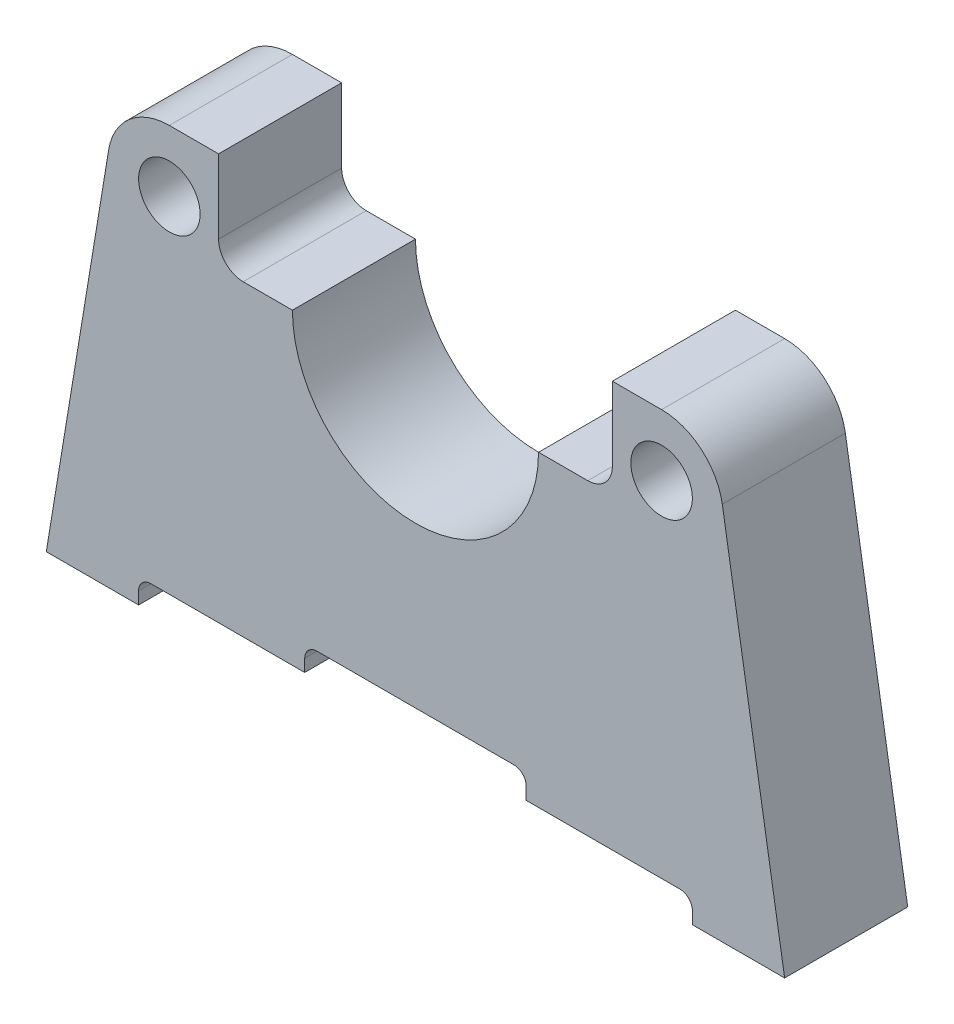
ISO-10303-21;
HEADER;
FILE_DESCRIPTION(('STEP AP214'),'2;1');
FILE_NAME('part.step','',(''),(''),'','','');
FILE_SCHEMA(('AUTOMOTIVE_DESIGN { 1 0 10303 214 1 1 1 1 }'));
ENDSEC;
DATA;
#1=APPLICATION_CONTEXT('core data for automotive mechanical design processes');
#2=APPLICATION_PROTOCOL_DEFINITION('international standard','automotive_design',2000,#1);
#3=PRODUCT_CONTEXT('',#1,'mechanical');
#4=PRODUCT('Part','Part','',(#3));
#5=PRODUCT_RELATED_PRODUCT_CATEGORY('part','',(#4));
#6=PRODUCT_DEFINITION_FORMATION('','',#4);
#7=PRODUCT_DEFINITION_CONTEXT('part definition',#1,'design');
#8=PRODUCT_DEFINITION('design','',#6,#7);
#9=PRODUCT_DEFINITION_SHAPE('','',#8);
#10=(LENGTH_UNIT() NAMED_UNIT(*) SI_UNIT(.MILLI.,.METRE.));
#11=(NAMED_UNIT(*) PLANE_ANGLE_UNIT() SI_UNIT($,.RADIAN.));
#12=(NAMED_UNIT(*) SI_UNIT($,.STERADIAN.) SOLID_ANGLE_UNIT());
#13=UNCERTAINTY_MEASURE_WITH_UNIT(LENGTH_MEASURE(1.E-05),#10,'distance_accuracy_value','');
#14=(GEOMETRIC_REPRESENTATION_CONTEXT(3) GLOBAL_UNCERTAINTY_ASSIGNED_CONTEXT((#13)) GLOBAL_UNIT_ASSIGNED_CONTEXT((#10,
#11,#12)) REPRESENTATION_CONTEXT('',''));
#15=CARTESIAN_POINT('',(0.,0.,0.));
#16=DIRECTION('',(0.,0.,1.));
#17=DIRECTION('',(1.,0.,0.));
#18=AXIS2_PLACEMENT_3D('',#15,#16,#17);
#19=CARTESIAN_POINT('',(-20.,30.,10.));
#20=DIRECTION('',(0.,0.,-1.));
#21=DIRECTION('',(-1.,0.,0.));
#22=AXIS2_PLACEMENT_3D('',#19,#20,#21);
#23=PLANE('',#22);
#24=DIRECTION('',(-0.16224989991992,-0.98674969975976,0.));
#25=VECTOR('',#24,1.);
#26=CARTESIAN_POINT('',(-30.,0.,10.));
#27=LINE('',#26,#25);
#28=CARTESIAN_POINT('',(-24.9337484987988,30.8112494995996,10.));
#29=VERTEX_POINT('',#28);
#30=CARTESIAN_POINT('',(-30.,0.,10.));
#31=VERTEX_POINT('',#30);
#32=EDGE_CURVE('E293',#29,#31,#27,.T.);
#33=ORIENTED_EDGE('',*,*,#32,.T.);
#34=DIRECTION('',(1.,0.,0.));
#35=VECTOR('',#34,1.);
#36=CARTESIAN_POINT('',(-30.,0.,10.));
#37=LINE('',#36,#35);
#38=CARTESIAN_POINT('',(-22.5,0.,10.));
#39=VERTEX_POINT('',#38);
#40=EDGE_CURVE('E151',#31,#39,#37,.T.);
#41=ORIENTED_EDGE('',*,*,#40,.T.);
#42=DIRECTION('',(0.,1.,0.));
#43=VECTOR('',#42,1.);
#44=CARTESIAN_POINT('',(-22.5,0.,10.));
#45=LINE('',#44,#43);
#46=CARTESIAN_POINT('',(-22.5,1.,10.));
#47=VERTEX_POINT('',#46);
#48=EDGE_CURVE('E362',#39,#47,#45,.T.);
#49=ORIENTED_EDGE('',*,*,#48,.T.);
#50=CARTESIAN_POINT('',(-21.5,1.,10.));
#51=DIRECTION('',(0.,0.,-1.));
#52=DIRECTION('',(-1.,0.,0.));
#53=AXIS2_PLACEMENT_3D('',#50,#51,#52);
#54=CIRCLE('',#53,1.);
#55=CARTESIAN_POINT('',(-21.5,2.,10.));
#56=VERTEX_POINT('',#55);
#57=EDGE_CURVE('E381',#47,#56,#54,.T.);
#58=ORIENTED_EDGE('',*,*,#57,.T.);
#59=DIRECTION('',(1.,0.,0.));
#60=VECTOR('',#59,1.);
#61=CARTESIAN_POINT('',(-21.5,2.,10.));
#62=LINE('',#61,#60);
#63=CARTESIAN_POINT('',(-9.,2.,10.));
#64=VERTEX_POINT('',#63);
#65=EDGE_CURVE('E378',#56,#64,#62,.T.);
#66=ORIENTED_EDGE('',*,*,#65,.T.);
#67=DIRECTION('',(0.,1.,0.));
#68=VECTOR('',#67,1.);
#69=CARTESIAN_POINT('',(-9.,2.,10.));
#70=LINE('',#69,#68);
#71=CARTESIAN_POINT('',(-9.,2.99999999999999,10.));
#72=VERTEX_POINT('',#71);
#73=EDGE_CURVE('E380',#64,#72,#70,.T.);
#74=ORIENTED_EDGE('',*,*,#73,.T.);
#75=CARTESIAN_POINT('',(-8.,2.99999999999999,10.));
#76=DIRECTION('',(0.,0.,-1.));
#77=DIRECTION('',(-1.,0.,0.));
#78=AXIS2_PLACEMENT_3D('',#75,#76,#77);
#79=CIRCLE('',#78,1.);
#80=CARTESIAN_POINT('',(-8.,3.99999999999999,10.));
#81=VERTEX_POINT('',#80);
#82=EDGE_CURVE('E383',#72,#81,#79,.T.);
#83=ORIENTED_EDGE('',*,*,#82,.T.);
#84=DIRECTION('',(1.,0.,0.));
#85=VECTOR('',#84,1.);
#86=CARTESIAN_POINT('',(-8.,3.99999999999999,10.));
#87=LINE('',#86,#85);
#88=CARTESIAN_POINT('',(8.,3.99999999999999,10.));
#89=VERTEX_POINT('',#88);
#90=EDGE_CURVE('E389',#81,#89,#87,.T.);
#91=ORIENTED_EDGE('',*,*,#90,.T.);
#92=CARTESIAN_POINT('',(8.,2.99999999999999,10.));
#93=DIRECTION('',(0.,0.,-1.));
#94=DIRECTION('',(1.,0.,0.));
#95=AXIS2_PLACEMENT_3D('',#92,#93,#94);
#96=CIRCLE('',#95,1.);
#97=CARTESIAN_POINT('',(9.,2.99999999999999,10.));
#98=VERTEX_POINT('',#97);
#99=EDGE_CURVE('E391',#89,#98,#96,.T.);
#100=ORIENTED_EDGE('',*,*,#99,.T.);
#101=DIRECTION('',(0.,-1.,0.));
#102=VECTOR('',#101,1.);
#103=CARTESIAN_POINT('',(9.,2.,10.));
#104=LINE('',#103,#102);
#105=CARTESIAN_POINT('',(9.,2.,10.));
#106=VERTEX_POINT('',#105);
#107=EDGE_CURVE('E393',#98,#106,#104,.T.);
#108=ORIENTED_EDGE('',*,*,#107,.T.);
#109=DIRECTION('',(1.,0.,0.));
#110=VECTOR('',#109,1.);
#111=CARTESIAN_POINT('',(21.5,2.,10.));
#112=LINE('',#111,#110);
#113=CARTESIAN_POINT('',(21.5,2.,10.));
#114=VERTEX_POINT('',#113);
#115=EDGE_CURVE('E395',#106,#114,#112,.T.);
#116=ORIENTED_EDGE('',*,*,#115,.T.);
#117=CARTESIAN_POINT('',(21.5,1.,10.));
#118=DIRECTION('',(0.,0.,-1.));
#119=DIRECTION('',(-1.,0.,0.));
#120=AXIS2_PLACEMENT_3D('',#117,#118,#119);
#121=CIRCLE('',#120,1.);
#122=CARTESIAN_POINT('',(22.5,1.,10.));
#123=VERTEX_POINT('',#122);
#124=EDGE_CURVE('E397',#114,#123,#121,.T.);
#125=ORIENTED_EDGE('',*,*,#124,.T.);
#126=DIRECTION('',(0.,-1.,0.));
#127=VECTOR('',#126,1.);
#128=CARTESIAN_POINT('',(22.5,0.,10.));
#129=LINE('',#128,#127);
#130=CARTESIAN_POINT('',(22.5,0.,10.));
#131=VERTEX_POINT('',#130);
#132=EDGE_CURVE('E399',#123,#131,#129,.T.);
#133=ORIENTED_EDGE('',*,*,#132,.T.);
#134=DIRECTION('',(1.,0.,0.));
#135=VECTOR('',#134,1.);
#136=CARTESIAN_POINT('',(30.,0.,10.));
#137=LINE('',#136,#135);
#138=CARTESIAN_POINT('',(30.,0.,10.));
#139=VERTEX_POINT('',#138);
#140=EDGE_CURVE('E401',#131,#139,#137,.T.);
#141=ORIENTED_EDGE('',*,*,#140,.T.);
#142=DIRECTION('',(-0.16224989991992,0.98674969975976,0.));
#143=VECTOR('',#142,1.);
#144=CARTESIAN_POINT('',(30.,0.,10.));
#145=LINE('',#144,#143);
#146=CARTESIAN_POINT('',(24.9337484987988,30.8112494995996,10.));
#147=VERTEX_POINT('',#146);
#148=EDGE_CURVE('E403',#139,#147,#145,.T.);
#149=ORIENTED_EDGE('',*,*,#148,.T.);
#150=CARTESIAN_POINT('',(20.,30.,10.));
#151=DIRECTION('',(0.,0.,1.));
#152=DIRECTION('',(-1.,0.,0.));
#153=AXIS2_PLACEMENT_3D('',#150,#151,#152);
#154=CIRCLE('',#153,5.);
#155=CARTESIAN_POINT('',(20.,35.,10.));
#156=VERTEX_POINT('',#155);
#157=EDGE_CURVE('E405',#147,#156,#154,.T.);
#158=ORIENTED_EDGE('',*,*,#157,.T.);
#159=DIRECTION('',(-1.,0.,0.));
#160=VECTOR('',#159,1.);
#161=CARTESIAN_POINT('',(20.,35.,10.));
#162=LINE('',#161,#160);
#163=CARTESIAN_POINT('',(16.,35.,10.));
#164=VERTEX_POINT('',#163);
#165=EDGE_CURVE('E407',#156,#164,#162,.T.);
#166=ORIENTED_EDGE('',*,*,#165,.T.);
#167=DIRECTION('',(0.,-1.,0.));
#168=VECTOR('',#167,1.);
#169=CARTESIAN_POINT('',(16.,35.,10.));
#170=LINE('',#169,#168);
#171=CARTESIAN_POINT('',(16.,29.,10.));
#172=VERTEX_POINT('',#171);
#173=EDGE_CURVE('E409',#164,#172,#170,.T.);
#174=ORIENTED_EDGE('',*,*,#173,.T.);
#175=CARTESIAN_POINT('',(14.,29.,10.));
#176=DIRECTION('',(0.,0.,-1.));
#177=DIRECTION('',(1.,0.,0.));
#178=AXIS2_PLACEMENT_3D('',#175,#176,#177);
#179=CIRCLE('',#178,2.);
#180=CARTESIAN_POINT('',(14.,27.,10.));
#181=VERTEX_POINT('',#180);
#182=EDGE_CURVE('E411',#172,#181,#179,.T.);
#183=ORIENTED_EDGE('',*,*,#182,.T.);
#184=DIRECTION('',(-1.,0.,0.));
#185=VECTOR('',#184,1.);
#186=CARTESIAN_POINT('',(14.,27.,10.));
#187=LINE('',#186,#185);
#188=CARTESIAN_POINT('',(10.,27.,10.));
#189=VERTEX_POINT('',#188);
#190=EDGE_CURVE('E413',#181,#189,#187,.T.);
#191=ORIENTED_EDGE('',*,*,#190,.T.);
#192=CARTESIAN_POINT('',(0.,27.,10.));
#193=DIRECTION('',(0.,0.,-1.));
#194=DIRECTION('',(1.,0.,0.));
#195=AXIS2_PLACEMENT_3D('',#192,#193,#194);
#196=CIRCLE('',#195,10.);
#197=CARTESIAN_POINT('',(-10.,27.,10.));
#198=VERTEX_POINT('',#197);
#199=EDGE_CURVE('E415',#189,#198,#196,.T.);
#200=ORIENTED_EDGE('',*,*,#199,.T.);
#201=DIRECTION('',(-1.,0.,0.));
#202=VECTOR('',#201,1.);
#203=CARTESIAN_POINT('',(-14.,27.,10.));
#204=LINE('',#203,#202);
#205=CARTESIAN_POINT('',(-14.,27.,10.));
#206=VERTEX_POINT('',#205);
#207=EDGE_CURVE('E417',#198,#206,#204,.T.);
#208=ORIENTED_EDGE('',*,*,#207,.T.);
#209=CARTESIAN_POINT('',(-14.,29.,10.));
#210=DIRECTION('',(0.,0.,-1.));
#211=DIRECTION('',(1.,0.,0.));
#212=AXIS2_PLACEMENT_3D('',#209,#210,#211);
#213=CIRCLE('',#212,2.);
#214=CARTESIAN_POINT('',(-16.,29.,10.));
#215=VERTEX_POINT('',#214);
#216=EDGE_CURVE('E224',#206,#215,#213,.T.);
#217=ORIENTED_EDGE('',*,*,#216,.T.);
#218=DIRECTION('',(0.,1.,0.));
#219=VECTOR('',#218,1.);
#220=CARTESIAN_POINT('',(-16.,35.,10.));
#221=LINE('',#220,#219);
#222=CARTESIAN_POINT('',(-16.,35.,10.));
#223=VERTEX_POINT('',#222);
#224=EDGE_CURVE('E218',#215,#223,#221,.T.);
#225=ORIENTED_EDGE('',*,*,#224,.T.);
#226=DIRECTION('',(-1.,0.,0.));
#227=VECTOR('',#226,1.);
#228=CARTESIAN_POINT('',(-20.,35.,10.));
#229=LINE('',#228,#227);
#230=CARTESIAN_POINT('',(-20.,35.,10.));
#231=VERTEX_POINT('',#230);
#232=EDGE_CURVE('E222',#223,#231,#229,.T.);
#233=ORIENTED_EDGE('',*,*,#232,.T.);
#234=CARTESIAN_POINT('',(-20.,30.,10.));
#235=DIRECTION('',(0.,0.,1.));
#236=DIRECTION('',(-1.,0.,0.));
#237=AXIS2_PLACEMENT_3D('',#234,#235,#236);
#238=CIRCLE('',#237,5.00000000000002);
#239=EDGE_CURVE('E54',#231,#29,#238,.T.);
#240=ORIENTED_EDGE('',*,*,#239,.T.);
#241=EDGE_LOOP('',(#33,#41,#49,#58,#66,#74,#83,#91,#100,#108,#116,#125,#133,#141,#149,#158,#166,
#174,#183,#191,#200,#208,#217,#225,#233,#240));
#242=FACE_BOUND('',#241,.T.);
#243=CARTESIAN_POINT('',(20.,30.,10.));
#244=DIRECTION('',(0.,0.,1.));
#245=DIRECTION('',(-1.,0.,0.));
#246=AXIS2_PLACEMENT_3D('',#243,#244,#245);
#247=CIRCLE('',#246,2.5);
#248=CARTESIAN_POINT('',(17.5,30.,10.));
#249=VERTEX_POINT('',#248);
#250=EDGE_CURVE('E246',#249,#249,#247,.T.);
#251=ORIENTED_EDGE('',*,*,#250,.F.);
#252=EDGE_LOOP('',(#251));
#253=FACE_BOUND('',#252,.T.);
#254=CARTESIAN_POINT('',(-20.,30.,10.));
#255=DIRECTION('',(0.,0.,1.));
#256=DIRECTION('',(1.,0.,0.));
#257=AXIS2_PLACEMENT_3D('',#254,#255,#256);
#258=CIRCLE('',#257,2.5);
#259=CARTESIAN_POINT('',(-17.5,30.,10.));
#260=VERTEX_POINT('',#259);
#261=EDGE_CURVE('E458',#260,#260,#258,.T.);
#262=ORIENTED_EDGE('',*,*,#261,.F.);
#263=EDGE_LOOP('',(#262));
#264=FACE_BOUND('',#263,.T.);
#265=ADVANCED_FACE('F37',(#242,#253,#264),#23,.F.);
#266=CARTESIAN_POINT('',(-20.,30.,0.));
#267=DIRECTION('',(0.,0.,-1.));
#268=DIRECTION('',(-1.,0.,0.));
#269=AXIS2_PLACEMENT_3D('',#266,#267,#268);
#270=PLANE('',#269);
#271=CARTESIAN_POINT('',(20.,30.,0.));
#272=DIRECTION('',(0.,0.,1.));
#273=DIRECTION('',(-1.,0.,0.));
#274=AXIS2_PLACEMENT_3D('',#271,#272,#273);
#275=CIRCLE('',#274,2.5);
#276=CARTESIAN_POINT('',(17.5,30.,0.));
#277=VERTEX_POINT('',#276);
#278=EDGE_CURVE('E463',#277,#277,#275,.T.);
#279=ORIENTED_EDGE('',*,*,#278,.T.);
#280=EDGE_LOOP('',(#279));
#281=FACE_BOUND('',#280,.T.);
#282=DIRECTION('',(-0.16224989991992,-0.98674969975976,0.));
#283=VECTOR('',#282,1.);
#284=CARTESIAN_POINT('',(-30.,0.,0.));
#285=LINE('',#284,#283);
#286=CARTESIAN_POINT('',(-24.9337484987988,30.8112494995996,0.));
#287=VERTEX_POINT('',#286);
#288=CARTESIAN_POINT('',(-30.,0.,0.));
#289=VERTEX_POINT('',#288);
#290=EDGE_CURVE('E242',#287,#289,#285,.T.);
#291=ORIENTED_EDGE('',*,*,#290,.F.);
#292=CARTESIAN_POINT('',(-20.,30.,0.));
#293=DIRECTION('',(0.,0.,1.));
#294=DIRECTION('',(-1.,0.,0.));
#295=AXIS2_PLACEMENT_3D('',#292,#293,#294);
#296=CIRCLE('',#295,5.00000000000002);
#297=CARTESIAN_POINT('',(-20.,35.,0.));
#298=VERTEX_POINT('',#297);
#299=EDGE_CURVE('E143',#298,#287,#296,.T.);
#300=ORIENTED_EDGE('',*,*,#299,.F.);
#301=DIRECTION('',(-1.,0.,0.));
#302=VECTOR('',#301,1.);
#303=CARTESIAN_POINT('',(-20.,35.,0.));
#304=LINE('',#303,#302);
#305=CARTESIAN_POINT('',(-16.,35.,0.));
#306=VERTEX_POINT('',#305);
#307=EDGE_CURVE('E137',#306,#298,#304,.T.);
#308=ORIENTED_EDGE('',*,*,#307,.F.);
#309=DIRECTION('',(0.,1.,0.));
#310=VECTOR('',#309,1.);
#311=CARTESIAN_POINT('',(-16.,35.,0.));
#312=LINE('',#311,#310);
#313=CARTESIAN_POINT('',(-16.,29.,0.));
#314=VERTEX_POINT('',#313);
#315=EDGE_CURVE('E232',#314,#306,#312,.T.);
#316=ORIENTED_EDGE('',*,*,#315,.F.);
#317=CARTESIAN_POINT('',(-14.,29.,0.));
#318=DIRECTION('',(0.,0.,-1.));
#319=DIRECTION('',(1.,0.,0.));
#320=AXIS2_PLACEMENT_3D('',#317,#318,#319);
#321=CIRCLE('',#320,2.);
#322=CARTESIAN_POINT('',(-14.,27.,0.));
#323=VERTEX_POINT('',#322);
#324=EDGE_CURVE('E288',#323,#314,#321,.T.);
#325=ORIENTED_EDGE('',*,*,#324,.F.);
#326=DIRECTION('',(-1.,0.,0.));
#327=VECTOR('',#326,1.);
#328=CARTESIAN_POINT('',(-14.,27.,0.));
#329=LINE('',#328,#327);
#330=CARTESIAN_POINT('',(-10.,27.,0.));
#331=VERTEX_POINT('',#330);
#332=EDGE_CURVE('E286',#331,#323,#329,.T.);
#333=ORIENTED_EDGE('',*,*,#332,.F.);
#334=CARTESIAN_POINT('',(0.,27.,0.));
#335=DIRECTION('',(0.,0.,-1.));
#336=DIRECTION('',(1.,0.,0.));
#337=AXIS2_PLACEMENT_3D('',#334,#335,#336);
#338=CIRCLE('',#337,10.);
#339=CARTESIAN_POINT('',(10.,27.,0.));
#340=VERTEX_POINT('',#339);
#341=EDGE_CURVE('E284',#340,#331,#338,.T.);
#342=ORIENTED_EDGE('',*,*,#341,.F.);
#343=DIRECTION('',(-1.,0.,0.));
#344=VECTOR('',#343,1.);
#345=CARTESIAN_POINT('',(14.,27.,0.));
#346=LINE('',#345,#344);
#347=CARTESIAN_POINT('',(14.,27.,0.));
#348=VERTEX_POINT('',#347);
#349=EDGE_CURVE('E282',#348,#340,#346,.T.);
#350=ORIENTED_EDGE('',*,*,#349,.F.);
#351=CARTESIAN_POINT('',(14.,29.,0.));
#352=DIRECTION('',(0.,0.,-1.));
#353=DIRECTION('',(1.,0.,0.));
#354=AXIS2_PLACEMENT_3D('',#351,#352,#353);
#355=CIRCLE('',#354,2.);
#356=CARTESIAN_POINT('',(16.,29.,0.));
#357=VERTEX_POINT('',#356);
#358=EDGE_CURVE('E280',#357,#348,#355,.T.);
#359=ORIENTED_EDGE('',*,*,#358,.F.);
#360=DIRECTION('',(0.,-1.,0.));
#361=VECTOR('',#360,1.);
#362=CARTESIAN_POINT('',(16.,35.,0.));
#363=LINE('',#362,#361);
#364=CARTESIAN_POINT('',(16.,35.,0.));
#365=VERTEX_POINT('',#364);
#366=EDGE_CURVE('E278',#365,#357,#363,.T.);
#367=ORIENTED_EDGE('',*,*,#366,.F.);
#368=DIRECTION('',(-1.,0.,0.));
#369=VECTOR('',#368,1.);
#370=CARTESIAN_POINT('',(20.,35.,0.));
#371=LINE('',#370,#369);
#372=CARTESIAN_POINT('',(20.,35.,0.));
#373=VERTEX_POINT('',#372);
#374=EDGE_CURVE('E276',#373,#365,#371,.T.);
#375=ORIENTED_EDGE('',*,*,#374,.F.);
#376=CARTESIAN_POINT('',(20.,30.,0.));
#377=DIRECTION('',(0.,0.,1.));
#378=DIRECTION('',(-1.,0.,0.));
#379=AXIS2_PLACEMENT_3D('',#376,#377,#378);
#380=CIRCLE('',#379,5.);
#381=CARTESIAN_POINT('',(24.9337484987988,30.8112494995996,0.));
#382=VERTEX_POINT('',#381);
#383=EDGE_CURVE('E274',#382,#373,#380,.T.);
#384=ORIENTED_EDGE('',*,*,#383,.F.);
#385=DIRECTION('',(-0.16224989991992,0.98674969975976,0.));
#386=VECTOR('',#385,1.);
#387=CARTESIAN_POINT('',(30.,0.,0.));
#388=LINE('',#387,#386);
#389=CARTESIAN_POINT('',(30.,0.,0.));
#390=VERTEX_POINT('',#389);
#391=EDGE_CURVE('E272',#390,#382,#388,.T.);
#392=ORIENTED_EDGE('',*,*,#391,.F.);
#393=DIRECTION('',(1.,0.,0.));
#394=VECTOR('',#393,1.);
#395=CARTESIAN_POINT('',(30.,0.,0.));
#396=LINE('',#395,#394);
#397=CARTESIAN_POINT('',(22.5,0.,0.));
#398=VERTEX_POINT('',#397);
#399=EDGE_CURVE('E270',#398,#390,#396,.T.);
#400=ORIENTED_EDGE('',*,*,#399,.F.);
#401=DIRECTION('',(0.,-1.,0.));
#402=VECTOR('',#401,1.);
#403=CARTESIAN_POINT('',(22.5,0.,0.));
#404=LINE('',#403,#402);
#405=CARTESIAN_POINT('',(22.5,1.,0.));
#406=VERTEX_POINT('',#405);
#407=EDGE_CURVE('E268',#406,#398,#404,.T.);
#408=ORIENTED_EDGE('',*,*,#407,.F.);
#409=CARTESIAN_POINT('',(21.5,1.,0.));
#410=DIRECTION('',(0.,0.,-1.));
#411=DIRECTION('',(-1.,0.,0.));
#412=AXIS2_PLACEMENT_3D('',#409,#410,#411);
#413=CIRCLE('',#412,1.);
#414=CARTESIAN_POINT('',(21.5,2.,0.));
#415=VERTEX_POINT('',#414);
#416=EDGE_CURVE('E266',#415,#406,#413,.T.);
#417=ORIENTED_EDGE('',*,*,#416,.F.);
#418=DIRECTION('',(1.,0.,0.));
#419=VECTOR('',#418,1.);
#420=CARTESIAN_POINT('',(21.5,2.,0.));
#421=LINE('',#420,#419);
#422=CARTESIAN_POINT('',(9.,2.,0.));
#423=VERTEX_POINT('',#422);
#424=EDGE_CURVE('E264',#423,#415,#421,.T.);
#425=ORIENTED_EDGE('',*,*,#424,.F.);
#426=DIRECTION('',(0.,-1.,0.));
#427=VECTOR('',#426,1.);
#428=CARTESIAN_POINT('',(9.,2.,0.));
#429=LINE('',#428,#427);
#430=CARTESIAN_POINT('',(9.,2.99999999999999,0.));
#431=VERTEX_POINT('',#430);
#432=EDGE_CURVE('E262',#431,#423,#429,.T.);
#433=ORIENTED_EDGE('',*,*,#432,.F.);
#434=CARTESIAN_POINT('',(8.,2.99999999999999,0.));
#435=DIRECTION('',(0.,0.,-1.));
#436=DIRECTION('',(1.,0.,0.));
#437=AXIS2_PLACEMENT_3D('',#434,#435,#436);
#438=CIRCLE('',#437,1.);
#439=CARTESIAN_POINT('',(8.,3.99999999999999,0.));
#440=VERTEX_POINT('',#439);
#441=EDGE_CURVE('E260',#440,#431,#438,.T.);
#442=ORIENTED_EDGE('',*,*,#441,.F.);
#443=DIRECTION('',(1.,0.,0.));
#444=VECTOR('',#443,1.);
#445=CARTESIAN_POINT('',(-8.,3.99999999999999,0.));
#446=LINE('',#445,#444);
#447=CARTESIAN_POINT('',(-8.,3.99999999999999,0.));
#448=VERTEX_POINT('',#447);
#449=EDGE_CURVE('E258',#448,#440,#446,.T.);
#450=ORIENTED_EDGE('',*,*,#449,.F.);
#451=CARTESIAN_POINT('',(-8.,2.99999999999999,0.));
#452=DIRECTION('',(0.,0.,-1.));
#453=DIRECTION('',(-1.,0.,0.));
#454=AXIS2_PLACEMENT_3D('',#451,#452,#453);
#455=CIRCLE('',#454,1.);
#456=CARTESIAN_POINT('',(-9.,2.99999999999999,0.));
#457=VERTEX_POINT('',#456);
#458=EDGE_CURVE('E256',#457,#448,#455,.T.);
#459=ORIENTED_EDGE('',*,*,#458,.F.);
#460=DIRECTION('',(0.,1.,0.));
#461=VECTOR('',#460,1.);
#462=CARTESIAN_POINT('',(-9.,2.,0.));
#463=LINE('',#462,#461);
#464=CARTESIAN_POINT('',(-9.,2.,0.));
#465=VERTEX_POINT('',#464);
#466=EDGE_CURVE('E254',#465,#457,#463,.T.);
#467=ORIENTED_EDGE('',*,*,#466,.F.);
#468=DIRECTION('',(1.,0.,0.));
#469=VECTOR('',#468,1.);
#470=CARTESIAN_POINT('',(-21.5,2.,0.));
#471=LINE('',#470,#469);
#472=CARTESIAN_POINT('',(-21.5,2.,0.));
#473=VERTEX_POINT('',#472);
#474=EDGE_CURVE('E252',#473,#465,#471,.T.);
#475=ORIENTED_EDGE('',*,*,#474,.F.);
#476=CARTESIAN_POINT('',(-21.5,1.,0.));
#477=DIRECTION('',(0.,0.,-1.));
#478=DIRECTION('',(-1.,0.,0.));
#479=AXIS2_PLACEMENT_3D('',#476,#477,#478);
#480=CIRCLE('',#479,1.);
#481=CARTESIAN_POINT('',(-22.5,1.,0.));
#482=VERTEX_POINT('',#481);
#483=EDGE_CURVE('E250',#482,#473,#480,.T.);
#484=ORIENTED_EDGE('',*,*,#483,.F.);
#485=DIRECTION('',(0.,1.,0.));
#486=VECTOR('',#485,1.);
#487=CARTESIAN_POINT('',(-22.5,0.,0.));
#488=LINE('',#487,#486);
#489=CARTESIAN_POINT('',(-22.5,0.,0.));
#490=VERTEX_POINT('',#489);
#491=EDGE_CURVE('E248',#490,#482,#488,.T.);
#492=ORIENTED_EDGE('',*,*,#491,.F.);
#493=DIRECTION('',(1.,0.,0.));
#494=VECTOR('',#493,1.);
#495=CARTESIAN_POINT('',(-30.,0.,0.));
#496=LINE('',#495,#494);
#497=EDGE_CURVE('E245',#289,#490,#496,.T.);
#498=ORIENTED_EDGE('',*,*,#497,.F.);
#499=EDGE_LOOP('',(#291,#300,#308,#316,#325,#333,#342,#350,#359,#367,#375,#384,#392,#400,#408,
#417,#425,#433,#442,#450,#459,#467,#475,#484,#492,#498));
#500=FACE_BOUND('',#499,.T.);
#501=CARTESIAN_POINT('',(-20.,30.,0.));
#502=DIRECTION('',(0.,0.,1.));
#503=DIRECTION('',(1.,0.,0.));
#504=AXIS2_PLACEMENT_3D('',#501,#502,#503);
#505=CIRCLE('',#504,2.5);
#506=CARTESIAN_POINT('',(-17.5,30.,0.));
#507=VERTEX_POINT('',#506);
#508=EDGE_CURVE('E461',#507,#507,#505,.T.);
#509=ORIENTED_EDGE('',*,*,#508,.T.);
#510=EDGE_LOOP('',(#509));
#511=FACE_BOUND('',#510,.T.);
#512=ADVANCED_FACE('F366',(#281,#500,#511),#270,.T.);
#513=CARTESIAN_POINT('',(-30.,0.,10.));
#514=DIRECTION('',(0.98674969975976,-0.16224989991992,0.));
#515=DIRECTION('',(0.16224989991992,0.98674969975976,0.));
#516=AXIS2_PLACEMENT_3D('',#513,#514,#515);
#517=PLANE('',#516);
#518=ORIENTED_EDGE('',*,*,#290,.T.);
#519=DIRECTION('',(0.,0.,-1.));
#520=VECTOR('',#519,1.);
#521=CARTESIAN_POINT('',(-30.,0.,10.));
#522=LINE('',#521,#520);
#523=EDGE_CURVE('E11',#31,#289,#522,.T.);
#524=ORIENTED_EDGE('',*,*,#523,.F.);
#525=ORIENTED_EDGE('',*,*,#32,.F.);
#526=DIRECTION('',(0.,0.,-1.));
#527=VECTOR('',#526,1.);
#528=CARTESIAN_POINT('',(-24.9337484987988,30.8112494995996,10.));
#529=LINE('',#528,#527);
#530=EDGE_CURVE('E238',#29,#287,#529,.T.);
#531=ORIENTED_EDGE('',*,*,#530,.T.);
#532=EDGE_LOOP('',(#518,#524,#525,#531));
#533=FACE_BOUND('',#532,.T.);
#534=ADVANCED_FACE('F39',(#533),#517,.F.);
#535=CARTESIAN_POINT('',(-30.,0.,10.));
#536=DIRECTION('',(0.,1.,0.));
#537=DIRECTION('',(0.,0.,1.));
#538=AXIS2_PLACEMENT_3D('',#535,#536,#537);
#539=PLANE('',#538);
#540=ORIENTED_EDGE('',*,*,#497,.T.);
#541=DIRECTION('',(0.,0.,-1.));
#542=VECTOR('',#541,1.);
#543=CARTESIAN_POINT('',(-22.5,0.,10.));
#544=LINE('',#543,#542);
#545=EDGE_CURVE('E46',#39,#490,#544,.T.);
#546=ORIENTED_EDGE('',*,*,#545,.F.);
#547=ORIENTED_EDGE('',*,*,#40,.F.);
#548=ORIENTED_EDGE('',*,*,#523,.T.);
#549=EDGE_LOOP('',(#540,#546,#547,#548));
#550=FACE_BOUND('',#549,.T.);
#551=ADVANCED_FACE('F722',(#550),#539,.F.);
#552=CARTESIAN_POINT('',(-22.5,0.,10.));
#553=DIRECTION('',(-1.,0.,0.));
#554=DIRECTION('',(0.,0.,1.));
#555=AXIS2_PLACEMENT_3D('',#552,#553,#554);
#556=PLANE('',#555);
#557=ORIENTED_EDGE('',*,*,#491,.T.);
#558=DIRECTION('',(0.,0.,-1.));
#559=VECTOR('',#558,1.);
#560=CARTESIAN_POINT('',(-22.5,1.,10.));
#561=LINE('',#560,#559);
#562=EDGE_CURVE('E354',#47,#482,#561,.T.);
#563=ORIENTED_EDGE('',*,*,#562,.F.);
#564=ORIENTED_EDGE('',*,*,#48,.F.);
#565=ORIENTED_EDGE('',*,*,#545,.T.);
#566=EDGE_LOOP('',(#557,#563,#564,#565));
#567=FACE_BOUND('',#566,.T.);
#568=ADVANCED_FACE('F360',(#567),#556,.F.);
#569=CARTESIAN_POINT('',(-21.5,1.,10.));
#570=DIRECTION('',(0.,0.,-1.));
#571=DIRECTION('',(-1.,0.,0.));
#572=AXIS2_PLACEMENT_3D('',#569,#570,#571);
#573=CYLINDRICAL_SURFACE('',#572,1.);
#574=ORIENTED_EDGE('',*,*,#483,.T.);
#575=DIRECTION('',(0.,0.,-1.));
#576=VECTOR('',#575,1.);
#577=CARTESIAN_POINT('',(-21.5,2.,10.));
#578=LINE('',#577,#576);
#579=EDGE_CURVE('E351',#56,#473,#578,.T.);
#580=ORIENTED_EDGE('',*,*,#579,.F.);
#581=ORIENTED_EDGE('',*,*,#57,.F.);
#582=ORIENTED_EDGE('',*,*,#562,.T.);
#583=EDGE_LOOP('',(#574,#580,#581,#582));
#584=FACE_BOUND('',#583,.T.);
#585=ADVANCED_FACE('F372',(#584),#573,.F.);
#586=CARTESIAN_POINT('',(-21.5,2.,10.));
#587=DIRECTION('',(0.,1.,0.));
#588=DIRECTION('',(0.,0.,1.));
#589=AXIS2_PLACEMENT_3D('',#586,#587,#588);
#590=PLANE('',#589);
#591=ORIENTED_EDGE('',*,*,#474,.T.);
#592=DIRECTION('',(0.,0.,-1.));
#593=VECTOR('',#592,1.);
#594=CARTESIAN_POINT('',(-9.,2.,10.));
#595=LINE('',#594,#593);
#596=EDGE_CURVE('E348',#64,#465,#595,.T.);
#597=ORIENTED_EDGE('',*,*,#596,.F.);
#598=ORIENTED_EDGE('',*,*,#65,.F.);
#599=ORIENTED_EDGE('',*,*,#579,.T.);
#600=EDGE_LOOP('',(#591,#597,#598,#599));
#601=FACE_BOUND('',#600,.T.);
#602=ADVANCED_FACE('F376',(#601),#590,.F.);
#603=CARTESIAN_POINT('',(-9.,2.,10.));
#604=DIRECTION('',(-1.,0.,0.));
#605=DIRECTION('',(0.,0.,1.));
#606=AXIS2_PLACEMENT_3D('',#603,#604,#605);
#607=PLANE('',#606);
#608=ORIENTED_EDGE('',*,*,#466,.T.);
#609=DIRECTION('',(0.,0.,-1.));
#610=VECTOR('',#609,1.);
#611=CARTESIAN_POINT('',(-9.,2.99999999999999,10.));
#612=LINE('',#611,#610);
#613=EDGE_CURVE('E345',#72,#457,#612,.T.);
#614=ORIENTED_EDGE('',*,*,#613,.F.);
#615=ORIENTED_EDGE('',*,*,#73,.F.);
#616=ORIENTED_EDGE('',*,*,#596,.T.);
#617=EDGE_LOOP('',(#608,#614,#615,#616));
#618=FACE_BOUND('',#617,.T.);
#619=ADVANCED_FACE('F683',(#618),#607,.F.);
#620=CARTESIAN_POINT('',(-8.,2.99999999999999,10.));
#621=DIRECTION('',(0.,0.,-1.));
#622=DIRECTION('',(-1.,0.,0.));
#623=AXIS2_PLACEMENT_3D('',#620,#621,#622);
#624=CYLINDRICAL_SURFACE('',#623,1.);
#625=ORIENTED_EDGE('',*,*,#458,.T.);
#626=DIRECTION('',(0.,0.,-1.));
#627=VECTOR('',#626,1.);
#628=CARTESIAN_POINT('',(-8.,3.99999999999999,10.));
#629=LINE('',#628,#627);
#630=EDGE_CURVE('E342',#81,#448,#629,.T.);
#631=ORIENTED_EDGE('',*,*,#630,.F.);
#632=ORIENTED_EDGE('',*,*,#82,.F.);
#633=ORIENTED_EDGE('',*,*,#613,.T.);
#634=EDGE_LOOP('',(#625,#631,#632,#633));
#635=FACE_BOUND('',#634,.T.);
#636=ADVANCED_FACE('F672',(#635),#624,.F.);
#637=CARTESIAN_POINT('',(-8.,3.99999999999999,10.));
#638=DIRECTION('',(0.,1.,0.));
#639=DIRECTION('',(0.,0.,1.));
#640=AXIS2_PLACEMENT_3D('',#637,#638,#639);
#641=PLANE('',#640);
#642=ORIENTED_EDGE('',*,*,#449,.T.);
#643=DIRECTION('',(0.,0.,-1.));
#644=VECTOR('',#643,1.);
#645=CARTESIAN_POINT('',(8.,3.99999999999999,10.));
#646=LINE('',#645,#644);
#647=EDGE_CURVE('E339',#89,#440,#646,.T.);
#648=ORIENTED_EDGE('',*,*,#647,.F.);
#649=ORIENTED_EDGE('',*,*,#90,.F.);
#650=ORIENTED_EDGE('',*,*,#630,.T.);
#651=EDGE_LOOP('',(#642,#648,#649,#650));
#652=FACE_BOUND('',#651,.T.);
#653=ADVANCED_FACE('F661',(#652),#641,.F.);
#654=CARTESIAN_POINT('',(8.,2.99999999999999,10.));
#655=DIRECTION('',(0.,0.,-1.));
#656=DIRECTION('',(-1.,0.,0.));
#657=AXIS2_PLACEMENT_3D('',#654,#655,#656);
#658=CYLINDRICAL_SURFACE('',#657,1.);
#659=ORIENTED_EDGE('',*,*,#441,.T.);
#660=DIRECTION('',(0.,0.,-1.));
#661=VECTOR('',#660,1.);
#662=CARTESIAN_POINT('',(9.,2.99999999999999,10.));
#663=LINE('',#662,#661);
#664=EDGE_CURVE('E336',#98,#431,#663,.T.);
#665=ORIENTED_EDGE('',*,*,#664,.F.);
#666=ORIENTED_EDGE('',*,*,#99,.F.);
#667=ORIENTED_EDGE('',*,*,#647,.T.);
#668=EDGE_LOOP('',(#659,#665,#666,#667));
#669=FACE_BOUND('',#668,.T.);
#670=ADVANCED_FACE('F650',(#669),#658,.F.);
#671=CARTESIAN_POINT('',(9.,2.,10.));
#672=DIRECTION('',(1.,0.,0.));
#673=DIRECTION('',(0.,0.,-1.));
#674=AXIS2_PLACEMENT_3D('',#671,#672,#673);
#675=PLANE('',#674);
#676=ORIENTED_EDGE('',*,*,#432,.T.);
#677=DIRECTION('',(0.,0.,-1.));
#678=VECTOR('',#677,1.);
#679=CARTESIAN_POINT('',(9.,2.,10.));
#680=LINE('',#679,#678);
#681=EDGE_CURVE('E333',#106,#423,#680,.T.);
#682=ORIENTED_EDGE('',*,*,#681,.F.);
#683=ORIENTED_EDGE('',*,*,#107,.F.);
#684=ORIENTED_EDGE('',*,*,#664,.T.);
#685=EDGE_LOOP('',(#676,#682,#683,#684));
#686=FACE_BOUND('',#685,.T.);
#687=ADVANCED_FACE('F639',(#686),#675,.F.);
#688=CARTESIAN_POINT('',(21.5,2.,10.));
#689=DIRECTION('',(0.,1.,0.));
#690=DIRECTION('',(0.,0.,1.));
#691=AXIS2_PLACEMENT_3D('',#688,#689,#690);
#692=PLANE('',#691);
#693=ORIENTED_EDGE('',*,*,#424,.T.);
#694=DIRECTION('',(0.,0.,-1.));
#695=VECTOR('',#694,1.);
#696=CARTESIAN_POINT('',(21.5,2.,10.));
#697=LINE('',#696,#695);
#698=EDGE_CURVE('E330',#114,#415,#697,.T.);
#699=ORIENTED_EDGE('',*,*,#698,.F.);
#700=ORIENTED_EDGE('',*,*,#115,.F.);
#701=ORIENTED_EDGE('',*,*,#681,.T.);
#702=EDGE_LOOP('',(#693,#699,#700,#701));
#703=FACE_BOUND('',#702,.T.);
#704=ADVANCED_FACE('F628',(#703),#692,.F.);
#705=CARTESIAN_POINT('',(21.5,1.,10.));
#706=DIRECTION('',(0.,0.,-1.));
#707=DIRECTION('',(-1.,0.,0.));
#708=AXIS2_PLACEMENT_3D('',#705,#706,#707);
#709=CYLINDRICAL_SURFACE('',#708,1.);
#710=ORIENTED_EDGE('',*,*,#416,.T.);
#711=DIRECTION('',(0.,0.,-1.));
#712=VECTOR('',#711,1.);
#713=CARTESIAN_POINT('',(22.5,1.,10.));
#714=LINE('',#713,#712);
#715=EDGE_CURVE('E327',#123,#406,#714,.T.);
#716=ORIENTED_EDGE('',*,*,#715,.F.);
#717=ORIENTED_EDGE('',*,*,#124,.F.);
#718=ORIENTED_EDGE('',*,*,#698,.T.);
#719=EDGE_LOOP('',(#710,#716,#717,#718));
#720=FACE_BOUND('',#719,.T.);
#721=ADVANCED_FACE('F617',(#720),#709,.F.);
#722=CARTESIAN_POINT('',(22.5,0.,10.));
#723=DIRECTION('',(1.,0.,0.));
#724=DIRECTION('',(0.,0.,-1.));
#725=AXIS2_PLACEMENT_3D('',#722,#723,#724);
#726=PLANE('',#725);
#727=ORIENTED_EDGE('',*,*,#407,.T.);
#728=DIRECTION('',(0.,0.,-1.));
#729=VECTOR('',#728,1.);
#730=CARTESIAN_POINT('',(22.5,0.,10.));
#731=LINE('',#730,#729);
#732=EDGE_CURVE('E324',#131,#398,#731,.T.);
#733=ORIENTED_EDGE('',*,*,#732,.F.);
#734=ORIENTED_EDGE('',*,*,#132,.F.);
#735=ORIENTED_EDGE('',*,*,#715,.T.);
#736=EDGE_LOOP('',(#727,#733,#734,#735));
#737=FACE_BOUND('',#736,.T.);
#738=ADVANCED_FACE('F606',(#737),#726,.F.);
#739=CARTESIAN_POINT('',(30.,0.,10.));
#740=DIRECTION('',(0.,1.,0.));
#741=DIRECTION('',(0.,0.,1.));
#742=AXIS2_PLACEMENT_3D('',#739,#740,#741);
#743=PLANE('',#742);
#744=ORIENTED_EDGE('',*,*,#399,.T.);
#745=DIRECTION('',(0.,0.,-1.));
#746=VECTOR('',#745,1.);
#747=CARTESIAN_POINT('',(30.,0.,10.));
#748=LINE('',#747,#746);
#749=EDGE_CURVE('E321',#139,#390,#748,.T.);
#750=ORIENTED_EDGE('',*,*,#749,.F.);
#751=ORIENTED_EDGE('',*,*,#140,.F.);
#752=ORIENTED_EDGE('',*,*,#732,.T.);
#753=EDGE_LOOP('',(#744,#750,#751,#752));
#754=FACE_BOUND('',#753,.T.);
#755=ADVANCED_FACE('F595',(#754),#743,.F.);
#756=CARTESIAN_POINT('',(30.,0.,10.));
#757=DIRECTION('',(-0.98674969975976,-0.16224989991992,0.));
#758=DIRECTION('',(0.16224989991992,-0.98674969975976,0.));
#759=AXIS2_PLACEMENT_3D('',#756,#757,#758);
#760=PLANE('',#759);
#761=ORIENTED_EDGE('',*,*,#391,.T.);
#762=DIRECTION('',(0.,0.,-1.));
#763=VECTOR('',#762,1.);
#764=CARTESIAN_POINT('',(24.9337484987988,30.8112494995996,10.));
#765=LINE('',#764,#763);
#766=EDGE_CURVE('E318',#147,#382,#765,.T.);
#767=ORIENTED_EDGE('',*,*,#766,.F.);
#768=ORIENTED_EDGE('',*,*,#148,.F.);
#769=ORIENTED_EDGE('',*,*,#749,.T.);
#770=EDGE_LOOP('',(#761,#767,#768,#769));
#771=FACE_BOUND('',#770,.T.);
#772=ADVANCED_FACE('F584',(#771),#760,.F.);
#773=CARTESIAN_POINT('',(20.,30.,10.));
#774=DIRECTION('',(0.,0.,-1.));
#775=DIRECTION('',(-1.,0.,0.));
#776=AXIS2_PLACEMENT_3D('',#773,#774,#775);
#777=CYLINDRICAL_SURFACE('',#776,5.);
#778=ORIENTED_EDGE('',*,*,#383,.T.);
#779=DIRECTION('',(0.,0.,-1.));
#780=VECTOR('',#779,1.);
#781=CARTESIAN_POINT('',(20.,35.,10.));
#782=LINE('',#781,#780);
#783=EDGE_CURVE('E315',#156,#373,#782,.T.);
#784=ORIENTED_EDGE('',*,*,#783,.F.);
#785=ORIENTED_EDGE('',*,*,#157,.F.);
#786=ORIENTED_EDGE('',*,*,#766,.T.);
#787=EDGE_LOOP('',(#778,#784,#785,#786));
#788=FACE_BOUND('',#787,.T.);
#789=ADVANCED_FACE('F573',(#788),#777,.T.);
#790=CARTESIAN_POINT('',(20.,35.,10.));
#791=DIRECTION('',(0.,-1.,0.));
#792=DIRECTION('',(1.,0.,0.));
#793=AXIS2_PLACEMENT_3D('',#790,#791,#792);
#794=PLANE('',#793);
#795=ORIENTED_EDGE('',*,*,#374,.T.);
#796=DIRECTION('',(0.,0.,-1.));
#797=VECTOR('',#796,1.);
#798=CARTESIAN_POINT('',(16.,35.,10.));
#799=LINE('',#798,#797);
#800=EDGE_CURVE('E312',#164,#365,#799,.T.);
#801=ORIENTED_EDGE('',*,*,#800,.F.);
#802=ORIENTED_EDGE('',*,*,#165,.F.);
#803=ORIENTED_EDGE('',*,*,#783,.T.);
#804=EDGE_LOOP('',(#795,#801,#802,#803));
#805=FACE_BOUND('',#804,.T.);
#806=ADVANCED_FACE('F562',(#805),#794,.F.);
#807=CARTESIAN_POINT('',(16.,35.,10.));
#808=DIRECTION('',(1.,0.,0.));
#809=DIRECTION('',(0.,1.,0.));
#810=AXIS2_PLACEMENT_3D('',#807,#808,#809);
#811=PLANE('',#810);
#812=ORIENTED_EDGE('',*,*,#366,.T.);
#813=DIRECTION('',(0.,0.,-1.));
#814=VECTOR('',#813,1.);
#815=CARTESIAN_POINT('',(16.,29.,10.));
#816=LINE('',#815,#814);
#817=EDGE_CURVE('E309',#172,#357,#816,.T.);
#818=ORIENTED_EDGE('',*,*,#817,.F.);
#819=ORIENTED_EDGE('',*,*,#173,.F.);
#820=ORIENTED_EDGE('',*,*,#800,.T.);
#821=EDGE_LOOP('',(#812,#818,#819,#820));
#822=FACE_BOUND('',#821,.T.);
#823=ADVANCED_FACE('F551',(#822),#811,.F.);
#824=CARTESIAN_POINT('',(14.,29.,10.));
#825=DIRECTION('',(0.,0.,-1.));
#826=DIRECTION('',(-1.,0.,0.));
#827=AXIS2_PLACEMENT_3D('',#824,#825,#826);
#828=CYLINDRICAL_SURFACE('',#827,2.);
#829=ORIENTED_EDGE('',*,*,#358,.T.);
#830=DIRECTION('',(0.,0.,-1.));
#831=VECTOR('',#830,1.);
#832=CARTESIAN_POINT('',(14.,27.,10.));
#833=LINE('',#832,#831);
#834=EDGE_CURVE('E306',#181,#348,#833,.T.);
#835=ORIENTED_EDGE('',*,*,#834,.F.);
#836=ORIENTED_EDGE('',*,*,#182,.F.);
#837=ORIENTED_EDGE('',*,*,#817,.T.);
#838=EDGE_LOOP('',(#829,#835,#836,#837));
#839=FACE_BOUND('',#838,.T.);
#840=ADVANCED_FACE('F540',(#839),#828,.F.);
#841=CARTESIAN_POINT('',(14.,27.,10.));
#842=DIRECTION('',(0.,-1.,0.));
#843=DIRECTION('',(0.,0.,-1.));
#844=AXIS2_PLACEMENT_3D('',#841,#842,#843);
#845=PLANE('',#844);
#846=ORIENTED_EDGE('',*,*,#349,.T.);
#847=DIRECTION('',(0.,0.,-1.));
#848=VECTOR('',#847,1.);
#849=CARTESIAN_POINT('',(10.,27.,10.));
#850=LINE('',#849,#848);
#851=EDGE_CURVE('E303',#189,#340,#850,.T.);
#852=ORIENTED_EDGE('',*,*,#851,.F.);
#853=ORIENTED_EDGE('',*,*,#190,.F.);
#854=ORIENTED_EDGE('',*,*,#834,.T.);
#855=EDGE_LOOP('',(#846,#852,#853,#854));
#856=FACE_BOUND('',#855,.T.);
#857=ADVANCED_FACE('F529',(#856),#845,.F.);
#858=CARTESIAN_POINT('',(0.,27.,10.));
#859=DIRECTION('',(0.,0.,-1.));
#860=DIRECTION('',(-1.,0.,0.));
#861=AXIS2_PLACEMENT_3D('',#858,#859,#860);
#862=CYLINDRICAL_SURFACE('',#861,10.);
#863=ORIENTED_EDGE('',*,*,#341,.T.);
#864=DIRECTION('',(0.,0.,-1.));
#865=VECTOR('',#864,1.);
#866=CARTESIAN_POINT('',(-10.,27.,10.));
#867=LINE('',#866,#865);
#868=EDGE_CURVE('E300',#198,#331,#867,.T.);
#869=ORIENTED_EDGE('',*,*,#868,.F.);
#870=ORIENTED_EDGE('',*,*,#199,.F.);
#871=ORIENTED_EDGE('',*,*,#851,.T.);
#872=EDGE_LOOP('',(#863,#869,#870,#871));
#873=FACE_BOUND('',#872,.T.);
#874=ADVANCED_FACE('F519',(#873),#862,.F.);
#875=CARTESIAN_POINT('',(-14.,27.,10.));
#876=DIRECTION('',(0.,-1.,0.));
#877=DIRECTION('',(0.,0.,-1.));
#878=AXIS2_PLACEMENT_3D('',#875,#876,#877);
#879=PLANE('',#878);
#880=ORIENTED_EDGE('',*,*,#332,.T.);
#881=DIRECTION('',(0.,0.,-1.));
#882=VECTOR('',#881,1.);
#883=CARTESIAN_POINT('',(-14.,27.,10.));
#884=LINE('',#883,#882);
#885=EDGE_CURVE('E297',#206,#323,#884,.T.);
#886=ORIENTED_EDGE('',*,*,#885,.F.);
#887=ORIENTED_EDGE('',*,*,#207,.F.);
#888=ORIENTED_EDGE('',*,*,#868,.T.);
#889=EDGE_LOOP('',(#880,#886,#887,#888));
#890=FACE_BOUND('',#889,.T.);
#891=ADVANCED_FACE('F423',(#890),#879,.F.);
#892=CARTESIAN_POINT('',(-14.,29.,10.));
#893=DIRECTION('',(0.,0.,-1.));
#894=DIRECTION('',(-1.,0.,0.));
#895=AXIS2_PLACEMENT_3D('',#892,#893,#894);
#896=CYLINDRICAL_SURFACE('',#895,2.);
#897=ORIENTED_EDGE('',*,*,#324,.T.);
#898=DIRECTION('',(0.,0.,-1.));
#899=VECTOR('',#898,1.);
#900=CARTESIAN_POINT('',(-16.,29.,10.));
#901=LINE('',#900,#899);
#902=EDGE_CURVE('E233',#215,#314,#901,.T.);
#903=ORIENTED_EDGE('',*,*,#902,.F.);
#904=ORIENTED_EDGE('',*,*,#216,.F.);
#905=ORIENTED_EDGE('',*,*,#885,.T.);
#906=EDGE_LOOP('',(#897,#903,#904,#905));
#907=FACE_BOUND('',#906,.T.);
#908=ADVANCED_FACE('F427',(#907),#896,.F.);
#909=CARTESIAN_POINT('',(-16.,35.,10.));
#910=DIRECTION('',(-1.,0.,0.));
#911=DIRECTION('',(0.,-1.,0.));
#912=AXIS2_PLACEMENT_3D('',#909,#910,#911);
#913=PLANE('',#912);
#914=ORIENTED_EDGE('',*,*,#315,.T.);
#915=DIRECTION('',(0.,0.,-1.));
#916=VECTOR('',#915,1.);
#917=CARTESIAN_POINT('',(-16.,35.,10.));
#918=LINE('',#917,#916);
#919=EDGE_CURVE('E229',#223,#306,#918,.T.);
#920=ORIENTED_EDGE('',*,*,#919,.F.);
#921=ORIENTED_EDGE('',*,*,#224,.F.);
#922=ORIENTED_EDGE('',*,*,#902,.T.);
#923=EDGE_LOOP('',(#914,#920,#921,#922));
#924=FACE_BOUND('',#923,.T.);
#925=ADVANCED_FACE('F230',(#924),#913,.F.);
#926=CARTESIAN_POINT('',(-20.,35.,10.));
#927=DIRECTION('',(0.,-1.,0.));
#928=DIRECTION('',(0.,0.,-1.));
#929=AXIS2_PLACEMENT_3D('',#926,#927,#928);
#930=PLANE('',#929);
#931=ORIENTED_EDGE('',*,*,#307,.T.);
#932=DIRECTION('',(0.,0.,-1.));
#933=VECTOR('',#932,1.);
#934=CARTESIAN_POINT('',(-20.,35.,10.));
#935=LINE('',#934,#933);
#936=EDGE_CURVE('E234',#231,#298,#935,.T.);
#937=ORIENTED_EDGE('',*,*,#936,.F.);
#938=ORIENTED_EDGE('',*,*,#232,.F.);
#939=ORIENTED_EDGE('',*,*,#919,.T.);
#940=EDGE_LOOP('',(#931,#937,#938,#939));
#941=FACE_BOUND('',#940,.T.);
#942=ADVANCED_FACE('F236',(#941),#930,.F.);
#943=CARTESIAN_POINT('',(-20.,30.,10.));
#944=DIRECTION('',(0.,0.,-1.));
#945=DIRECTION('',(-1.,0.,0.));
#946=AXIS2_PLACEMENT_3D('',#943,#944,#945);
#947=CYLINDRICAL_SURFACE('',#946,5.00000000000002);
#948=ORIENTED_EDGE('',*,*,#299,.T.);
#949=ORIENTED_EDGE('',*,*,#530,.F.);
#950=ORIENTED_EDGE('',*,*,#239,.F.);
#951=ORIENTED_EDGE('',*,*,#936,.T.);
#952=EDGE_LOOP('',(#948,#949,#950,#951));
#953=FACE_BOUND('',#952,.T.);
#954=ADVANCED_FACE('F431',(#953),#947,.T.);
#955=CARTESIAN_POINT('',(20.,30.,10.));
#956=DIRECTION('',(0.,0.,-1.));
#957=DIRECTION('',(-1.,0.,0.));
#958=AXIS2_PLACEMENT_3D('',#955,#956,#957);
#959=CYLINDRICAL_SURFACE('',#958,2.5);
#960=ORIENTED_EDGE('',*,*,#250,.T.);
#961=EDGE_LOOP('',(#960));
#962=FACE_BOUND('',#961,.T.);
#963=ORIENTED_EDGE('',*,*,#278,.F.);
#964=EDGE_LOOP('',(#963));
#965=FACE_BOUND('',#964,.T.);
#966=ADVANCED_FACE('F433',(#962,#965),#959,.F.);
#967=CARTESIAN_POINT('',(-20.,30.,10.));
#968=DIRECTION('',(0.,0.,-1.));
#969=DIRECTION('',(-1.,0.,0.));
#970=AXIS2_PLACEMENT_3D('',#967,#968,#969);
#971=CYLINDRICAL_SURFACE('',#970,2.5);
#972=ORIENTED_EDGE('',*,*,#261,.T.);
#973=EDGE_LOOP('',(#972));
#974=FACE_BOUND('',#973,.T.);
#975=ORIENTED_EDGE('',*,*,#508,.F.);
#976=EDGE_LOOP('',(#975));
#977=FACE_BOUND('',#976,.T.);
#978=ADVANCED_FACE('F439',(#974,#977),#971,.F.);
#979=CLOSED_SHELL('',(#265,#512,#534,#551,#568,#585,#602,#619,#636,#653,#670,#687,#704,#721,
#738,#755,#772,#789,#806,#823,#840,#857,#874,#891,#908,#925,#942,#954,#966,#978));
#980=MANIFOLD_SOLID_BREP('B2',#979);
#981=ADVANCED_BREP_SHAPE_REPRESENTATION('',(#18,#980),#14);
#982=SHAPE_DEFINITION_REPRESENTATION(#9,#981);
ENDSEC;
END-ISO-10303-21;
